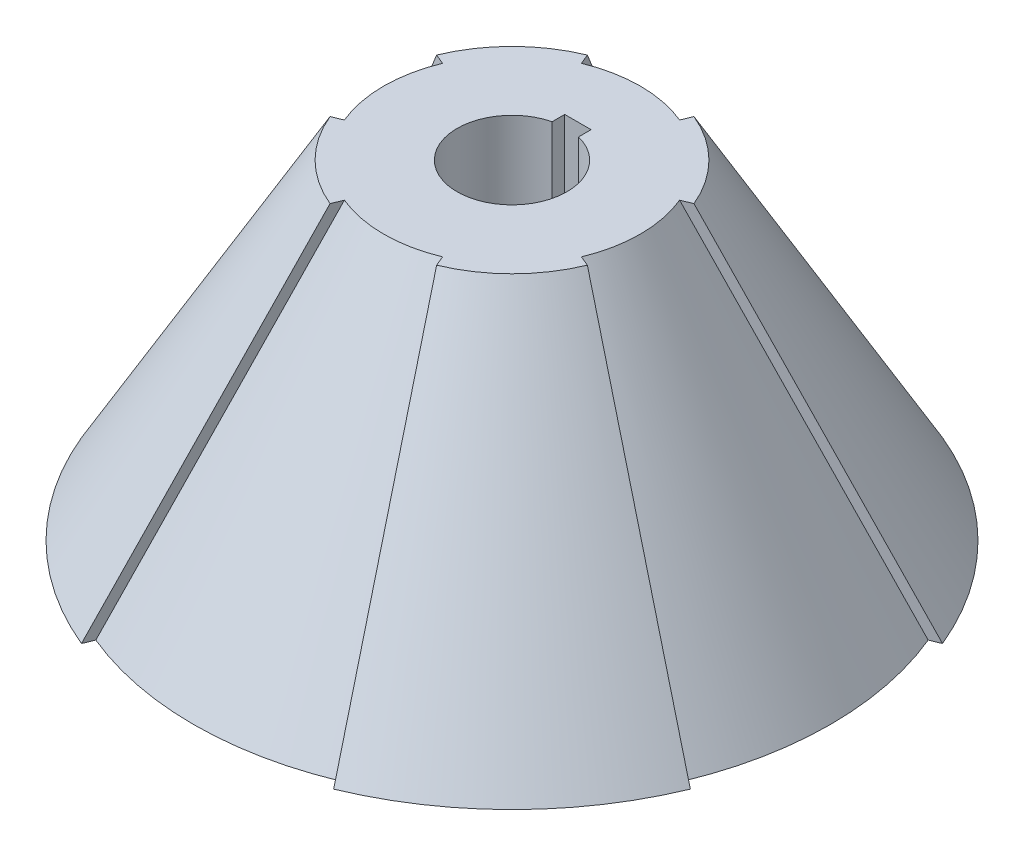
ISO-10303-21;
HEADER;
FILE_DESCRIPTION(('STEP AP214'),'2;1');
FILE_NAME('part.step','',(''),(''),'','','');
FILE_SCHEMA(('AUTOMOTIVE_DESIGN { 1 0 10303 214 1 1 1 1 }'));
ENDSEC;
DATA;
#1=APPLICATION_CONTEXT('core data for automotive mechanical design processes');
#2=APPLICATION_PROTOCOL_DEFINITION('international standard','automotive_design',2000,#1);
#3=PRODUCT_CONTEXT('',#1,'mechanical');
#4=PRODUCT('Part','Part','',(#3));
#5=PRODUCT_RELATED_PRODUCT_CATEGORY('part','',(#4));
#6=PRODUCT_DEFINITION_FORMATION('','',#4);
#7=PRODUCT_DEFINITION_CONTEXT('part definition',#1,'design');
#8=PRODUCT_DEFINITION('design','',#6,#7);
#9=PRODUCT_DEFINITION_SHAPE('','',#8);
#10=(LENGTH_UNIT() NAMED_UNIT(*) SI_UNIT(.MILLI.,.METRE.));
#11=(NAMED_UNIT(*) PLANE_ANGLE_UNIT() SI_UNIT($,.RADIAN.));
#12=(NAMED_UNIT(*) SI_UNIT($,.STERADIAN.) SOLID_ANGLE_UNIT());
#13=UNCERTAINTY_MEASURE_WITH_UNIT(LENGTH_MEASURE(1.E-05),#10,'distance_accuracy_value','');
#14=(GEOMETRIC_REPRESENTATION_CONTEXT(3) GLOBAL_UNCERTAINTY_ASSIGNED_CONTEXT((#13)) GLOBAL_UNIT_ASSIGNED_CONTEXT((#10,
#11,#12)) REPRESENTATION_CONTEXT('',''));
#15=CARTESIAN_POINT('',(0.,0.,0.));
#16=DIRECTION('',(0.,0.,1.));
#17=DIRECTION('',(1.,0.,0.));
#18=AXIS2_PLACEMENT_3D('',#15,#16,#17);
#19=CARTESIAN_POINT('',(38.1,0.,0.));
#20=DIRECTION('',(0.,-1.,0.));
#21=DIRECTION('',(0.,0.,-1.));
#22=AXIS2_PLACEMENT_3D('',#19,#20,#21);
#23=PLANE('',#22);
#24=CARTESIAN_POINT('',(0.,0.,0.));
#25=DIRECTION('',(0.,-1.,0.));
#26=DIRECTION('',(0.,0.,-1.));
#27=AXIS2_PLACEMENT_3D('',#24,#25,#26);
#28=CIRCLE('',#27,6.35);
#29=CARTESIAN_POINT('',(1.524,0.,-6.16440783855189));
#30=VERTEX_POINT('',#29);
#31=CARTESIAN_POINT('',(-1.524,0.,-6.16440783855189));
#32=VERTEX_POINT('',#31);
#33=EDGE_CURVE('E326',#30,#32,#28,.T.);
#34=ORIENTED_EDGE('',*,*,#33,.F.);
#35=DIRECTION('',(0.,0.,-1.));
#36=VECTOR('',#35,1.);
#37=CARTESIAN_POINT('',(1.524,0.,0.));
#38=LINE('',#37,#36);
#39=CARTESIAN_POINT('',(1.524,0.,-7.62));
#40=VERTEX_POINT('',#39);
#41=EDGE_CURVE('E311',#30,#40,#38,.T.);
#42=ORIENTED_EDGE('',*,*,#41,.T.);
#43=DIRECTION('',(-1.,0.,0.));
#44=VECTOR('',#43,1.);
#45=CARTESIAN_POINT('',(38.1,0.,-7.62));
#46=LINE('',#45,#44);
#47=CARTESIAN_POINT('',(-1.524,0.,-7.62));
#48=VERTEX_POINT('',#47);
#49=EDGE_CURVE('E308',#40,#48,#46,.T.);
#50=ORIENTED_EDGE('',*,*,#49,.T.);
#51=DIRECTION('',(0.,0.,1.));
#52=VECTOR('',#51,1.);
#53=CARTESIAN_POINT('',(-1.524,0.,0.));
#54=LINE('',#53,#52);
#55=EDGE_CURVE('E303',#48,#32,#54,.T.);
#56=ORIENTED_EDGE('',*,*,#55,.T.);
#57=EDGE_LOOP('',(#34,#42,#50,#56));
#58=FACE_BOUND('',#57,.T.);
#59=CARTESIAN_POINT('',(0.,0.,0.));
#60=DIRECTION('',(0.,-1.,0.));
#61=DIRECTION('',(0.,0.,-1.));
#62=AXIS2_PLACEMENT_3D('',#59,#60,#61);
#63=CIRCLE('',#62,38.1);
#64=CARTESIAN_POINT('',(-14.58023877311,0.,35.19981018868));
#65=VERTEX_POINT('',#64);
#66=CARTESIAN_POINT('',(-35.1998101886802,0.,14.5802387731096));
#67=VERTEX_POINT('',#66);
#68=EDGE_CURVE('E413',#65,#67,#63,.T.);
#69=ORIENTED_EDGE('',*,*,#68,.T.);
#70=DIRECTION('',(-0.923879532511291,0.,0.382683432365081));
#71=VECTOR('',#70,1.);
#72=CARTESIAN_POINT('',(-34.0264831823908,0.,14.0942308140059));
#73=LINE('',#72,#71);
#74=CARTESIAN_POINT('',(-34.0264831823908,0.,14.0942308140059));
#75=VERTEX_POINT('',#74);
#76=EDGE_CURVE('E218',#75,#67,#73,.T.);
#77=ORIENTED_EDGE('',*,*,#76,.F.);
#78=CARTESIAN_POINT('',(0.,0.,0.));
#79=DIRECTION('',(0.,-1.,0.));
#80=DIRECTION('',(-1.,0.,0.));
#81=AXIS2_PLACEMENT_3D('',#78,#79,#80);
#82=CIRCLE('',#81,36.83);
#83=CARTESIAN_POINT('',(-34.0264831823906,0.,-14.0942308140067));
#84=VERTEX_POINT('',#83);
#85=EDGE_CURVE('E197',#75,#84,#82,.T.);
#86=ORIENTED_EDGE('',*,*,#85,.T.);
#87=DIRECTION('',(-0.923879532511283,0.,-0.3826834323651));
#88=VECTOR('',#87,1.);
#89=CARTESIAN_POINT('',(-34.0264831823906,0.,-14.0942308140067));
#90=LINE('',#89,#88);
#91=CARTESIAN_POINT('',(-35.1998101886799,0.,-14.5802387731103));
#92=VERTEX_POINT('',#91);
#93=EDGE_CURVE('E201',#84,#92,#90,.T.);
#94=ORIENTED_EDGE('',*,*,#93,.T.);
#95=CARTESIAN_POINT('',(-14.58023877311,0.,-35.19981018868));
#96=VERTEX_POINT('',#95);
#97=EDGE_CURVE('E314',#92,#96,#63,.T.);
#98=ORIENTED_EDGE('',*,*,#97,.T.);
#99=DIRECTION('',(-0.382683432365091,0.,-0.923879532511287));
#100=VECTOR('',#99,1.);
#101=CARTESIAN_POINT('',(-14.0942308140063,0.,-34.0264831823907));
#102=LINE('',#101,#100);
#103=CARTESIAN_POINT('',(-14.0942308140063,0.,-34.0264831823907));
#104=VERTEX_POINT('',#103);
#105=EDGE_CURVE('E286',#104,#96,#102,.T.);
#106=ORIENTED_EDGE('',*,*,#105,.F.);
#107=CARTESIAN_POINT('',(0.,0.,0.));
#108=DIRECTION('',(0.,-1.,0.));
#109=DIRECTION('',(0.,0.,-1.));
#110=AXIS2_PLACEMENT_3D('',#107,#108,#109);
#111=CIRCLE('',#110,36.83);
#112=CARTESIAN_POINT('',(14.0942308140063,0.,-34.0264831823907));
#113=VERTEX_POINT('',#112);
#114=EDGE_CURVE('E289',#104,#113,#111,.T.);
#115=ORIENTED_EDGE('',*,*,#114,.T.);
#116=DIRECTION('',(0.382683432365091,0.,-0.923879532511287));
#117=VECTOR('',#116,1.);
#118=CARTESIAN_POINT('',(14.0942308140063,0.,-34.0264831823907));
#119=LINE('',#118,#117);
#120=CARTESIAN_POINT('',(14.58023877311,0.,-35.19981018868));
#121=VERTEX_POINT('',#120);
#122=EDGE_CURVE('E275',#113,#121,#119,.T.);
#123=ORIENTED_EDGE('',*,*,#122,.T.);
#124=CARTESIAN_POINT('',(35.1998101886801,0.,-14.5802387731098));
#125=VERTEX_POINT('',#124);
#126=EDGE_CURVE('E315',#121,#125,#63,.T.);
#127=ORIENTED_EDGE('',*,*,#126,.T.);
#128=DIRECTION('',(0.923879532511288,0.,-0.382683432365088));
#129=VECTOR('',#128,1.);
#130=CARTESIAN_POINT('',(34.0264831823907,0.,-14.0942308140062));
#131=LINE('',#130,#129);
#132=CARTESIAN_POINT('',(34.0264831823907,0.,-14.0942308140062));
#133=VERTEX_POINT('',#132);
#134=EDGE_CURVE('E260',#133,#125,#131,.T.);
#135=ORIENTED_EDGE('',*,*,#134,.F.);
#136=CARTESIAN_POINT('',(0.,0.,0.));
#137=DIRECTION('',(0.,-1.,0.));
#138=DIRECTION('',(1.,0.,0.));
#139=AXIS2_PLACEMENT_3D('',#136,#137,#138);
#140=CIRCLE('',#139,36.83);
#141=CARTESIAN_POINT('',(34.0264831823906,0.,14.0942308140064));
#142=VERTEX_POINT('',#141);
#143=EDGE_CURVE('E262',#133,#142,#140,.T.);
#144=ORIENTED_EDGE('',*,*,#143,.T.);
#145=DIRECTION('',(0.923879532511286,0.,0.382683432365094));
#146=VECTOR('',#145,1.);
#147=CARTESIAN_POINT('',(34.0264831823906,0.,14.0942308140064));
#148=LINE('',#147,#146);
#149=CARTESIAN_POINT('',(35.19981018868,0.,14.5802387731101));
#150=VERTEX_POINT('',#149);
#151=EDGE_CURVE('E250',#142,#150,#148,.T.);
#152=ORIENTED_EDGE('',*,*,#151,.T.);
#153=CARTESIAN_POINT('',(14.58023877311,0.,35.19981018868));
#154=VERTEX_POINT('',#153);
#155=EDGE_CURVE('E318',#150,#154,#63,.T.);
#156=ORIENTED_EDGE('',*,*,#155,.T.);
#157=DIRECTION('',(0.382683432365091,0.,0.923879532511287));
#158=VECTOR('',#157,1.);
#159=CARTESIAN_POINT('',(14.0942308140063,0.,34.0264831823907));
#160=LINE('',#159,#158);
#161=CARTESIAN_POINT('',(14.0942308140063,0.,34.0264831823907));
#162=VERTEX_POINT('',#161);
#163=EDGE_CURVE('E235',#162,#154,#160,.T.);
#164=ORIENTED_EDGE('',*,*,#163,.F.);
#165=CARTESIAN_POINT('',(0.,0.,0.));
#166=DIRECTION('',(0.,-1.,0.));
#167=DIRECTION('',(0.,0.,1.));
#168=AXIS2_PLACEMENT_3D('',#165,#166,#167);
#169=CIRCLE('',#168,36.83);
#170=CARTESIAN_POINT('',(-14.0942308140063,0.,34.0264831823907));
#171=VERTEX_POINT('',#170);
#172=EDGE_CURVE('E237',#162,#171,#169,.T.);
#173=ORIENTED_EDGE('',*,*,#172,.T.);
#174=DIRECTION('',(-0.382683432365091,0.,0.923879532511287));
#175=VECTOR('',#174,1.);
#176=CARTESIAN_POINT('',(-14.0942308140063,0.,34.0264831823907));
#177=LINE('',#176,#175);
#178=EDGE_CURVE('E225',#171,#65,#177,.T.);
#179=ORIENTED_EDGE('',*,*,#178,.T.);
#180=EDGE_LOOP('',(#69,#77,#86,#94,#98,#106,#115,#123,#127,#135,#144,#152,#156,#164,#173,#179));
#181=FACE_BOUND('',#180,.T.);
#182=ADVANCED_FACE('F50',(#58,#181),#23,.T.);
#183=CARTESIAN_POINT('',(6.35,38.1,0.));
#184=DIRECTION('',(0.,1.,0.));
#185=DIRECTION('',(0.,0.,1.));
#186=AXIS2_PLACEMENT_3D('',#183,#184,#185);
#187=PLANE('',#186);
#188=DIRECTION('',(1.,0.,0.));
#189=VECTOR('',#188,1.);
#190=CARTESIAN_POINT('',(6.35,38.1,-7.62));
#191=LINE('',#190,#189);
#192=CARTESIAN_POINT('',(-1.524,38.1,-7.62));
#193=VERTEX_POINT('',#192);
#194=CARTESIAN_POINT('',(1.524,38.1,-7.62));
#195=VERTEX_POINT('',#194);
#196=EDGE_CURVE('E57',#193,#195,#191,.T.);
#197=ORIENTED_EDGE('',*,*,#196,.T.);
#198=DIRECTION('',(0.,0.,1.));
#199=VECTOR('',#198,1.);
#200=CARTESIAN_POINT('',(1.524,38.1,0.));
#201=LINE('',#200,#199);
#202=CARTESIAN_POINT('',(1.524,38.1,-6.16440783855189));
#203=VERTEX_POINT('',#202);
#204=EDGE_CURVE('E13',#195,#203,#201,.T.);
#205=ORIENTED_EDGE('',*,*,#204,.T.);
#206=CARTESIAN_POINT('',(0.,38.1,0.));
#207=DIRECTION('',(0.,-1.,0.));
#208=DIRECTION('',(0.,0.,-1.));
#209=AXIS2_PLACEMENT_3D('',#206,#207,#208);
#210=CIRCLE('',#209,6.35);
#211=CARTESIAN_POINT('',(-1.524,38.1,-6.16440783855189));
#212=VERTEX_POINT('',#211);
#213=EDGE_CURVE('E322',#203,#212,#210,.T.);
#214=ORIENTED_EDGE('',*,*,#213,.T.);
#215=DIRECTION('',(0.,0.,-1.));
#216=VECTOR('',#215,1.);
#217=CARTESIAN_POINT('',(-1.524,38.1,0.));
#218=LINE('',#217,#216);
#219=EDGE_CURVE('E329',#212,#193,#218,.T.);
#220=ORIENTED_EDGE('',*,*,#219,.T.);
#221=EDGE_LOOP('',(#197,#205,#214,#220));
#222=FACE_BOUND('',#221,.T.);
#223=CARTESIAN_POINT('',(0.,38.1,0.));
#224=DIRECTION('',(0.,-1.,0.));
#225=DIRECTION('',(-1.,0.,0.));
#226=AXIS2_PLACEMENT_3D('',#223,#224,#225);
#227=CIRCLE('',#226,14.832954743875);
#228=CARTESIAN_POINT('',(-13.7038632945324,38.1,5.676326033502));
#229=VERTEX_POINT('',#228);
#230=CARTESIAN_POINT('',(-13.7038632945322,38.1,-5.67632603350228));
#231=VERTEX_POINT('',#230);
#232=EDGE_CURVE('E188',#229,#231,#227,.T.);
#233=ORIENTED_EDGE('',*,*,#232,.F.);
#234=DIRECTION('',(0.923879532511291,0.,-0.382683432365081));
#235=VECTOR('',#234,1.);
#236=CARTESIAN_POINT('',(-14.8771903008217,38.1,6.16233399260565));
#237=LINE('',#236,#235);
#238=CARTESIAN_POINT('',(-14.8771903008217,38.1,6.16233399260565));
#239=VERTEX_POINT('',#238);
#240=EDGE_CURVE('E215',#239,#229,#237,.T.);
#241=ORIENTED_EDGE('',*,*,#240,.F.);
#242=CARTESIAN_POINT('',(0.,38.1,0.));
#243=DIRECTION('',(0.,-1.,0.));
#244=DIRECTION('',(0.,0.,-1.));
#245=AXIS2_PLACEMENT_3D('',#242,#243,#244);
#246=CIRCLE('',#245,16.102954743875);
#247=CARTESIAN_POINT('',(-6.16233399260581,38.1,14.8771903008216));
#248=VERTEX_POINT('',#247);
#249=EDGE_CURVE('E394',#248,#239,#246,.T.);
#250=ORIENTED_EDGE('',*,*,#249,.F.);
#251=DIRECTION('',(0.382683432365091,0.,-0.923879532511287));
#252=VECTOR('',#251,1.);
#253=CARTESIAN_POINT('',(-6.16233399260581,38.1,14.8771903008217));
#254=LINE('',#253,#252);
#255=CARTESIAN_POINT('',(-5.67632603350214,38.1,13.7038632945323));
#256=VERTEX_POINT('',#255);
#257=EDGE_CURVE('E72',#248,#256,#254,.T.);
#258=ORIENTED_EDGE('',*,*,#257,.T.);
#259=CARTESIAN_POINT('',(0.,38.1,0.));
#260=DIRECTION('',(0.,-1.,0.));
#261=DIRECTION('',(0.,0.,1.));
#262=AXIS2_PLACEMENT_3D('',#259,#260,#261);
#263=CIRCLE('',#262,14.832954743875);
#264=CARTESIAN_POINT('',(5.67632603350214,38.1,13.7038632945323));
#265=VERTEX_POINT('',#264);
#266=EDGE_CURVE('E240',#265,#256,#263,.T.);
#267=ORIENTED_EDGE('',*,*,#266,.F.);
#268=DIRECTION('',(-0.382683432365091,0.,-0.923879532511287));
#269=VECTOR('',#268,1.);
#270=CARTESIAN_POINT('',(6.16233399260581,38.1,14.8771903008217));
#271=LINE('',#270,#269);
#272=CARTESIAN_POINT('',(6.16233399260581,38.1,14.8771903008217));
#273=VERTEX_POINT('',#272);
#274=EDGE_CURVE('E230',#273,#265,#271,.T.);
#275=ORIENTED_EDGE('',*,*,#274,.F.);
#276=CARTESIAN_POINT('',(14.8771903008216,38.1,6.16233399260586));
#277=VERTEX_POINT('',#276);
#278=EDGE_CURVE('E323',#277,#273,#246,.T.);
#279=ORIENTED_EDGE('',*,*,#278,.F.);
#280=DIRECTION('',(-0.923879532511286,0.,-0.382683432365094));
#281=VECTOR('',#280,1.);
#282=CARTESIAN_POINT('',(14.8771903008216,38.1,6.16233399260586));
#283=LINE('',#282,#281);
#284=CARTESIAN_POINT('',(13.7038632945323,38.1,5.67632603350219));
#285=VERTEX_POINT('',#284);
#286=EDGE_CURVE('E245',#277,#285,#283,.T.);
#287=ORIENTED_EDGE('',*,*,#286,.T.);
#288=CARTESIAN_POINT('',(0.,38.1,0.));
#289=DIRECTION('',(0.,-1.,0.));
#290=DIRECTION('',(1.,0.,0.));
#291=AXIS2_PLACEMENT_3D('',#288,#289,#290);
#292=CIRCLE('',#291,14.832954743875);
#293=CARTESIAN_POINT('',(13.7038632945323,38.1,-5.67632603350209));
#294=VERTEX_POINT('',#293);
#295=EDGE_CURVE('E265',#294,#285,#292,.T.);
#296=ORIENTED_EDGE('',*,*,#295,.F.);
#297=DIRECTION('',(-0.923879532511288,0.,0.382683432365088));
#298=VECTOR('',#297,1.);
#299=CARTESIAN_POINT('',(14.8771903008217,38.1,-6.16233399260576));
#300=LINE('',#299,#298);
#301=CARTESIAN_POINT('',(14.8771903008217,38.1,-6.16233399260576));
#302=VERTEX_POINT('',#301);
#303=EDGE_CURVE('E255',#302,#294,#300,.T.);
#304=ORIENTED_EDGE('',*,*,#303,.F.);
#305=CARTESIAN_POINT('',(6.16233399260581,38.1,-14.8771903008216));
#306=VERTEX_POINT('',#305);
#307=EDGE_CURVE('E319',#306,#302,#246,.T.);
#308=ORIENTED_EDGE('',*,*,#307,.F.);
#309=DIRECTION('',(-0.382683432365091,0.,0.923879532511287));
#310=VECTOR('',#309,1.);
#311=CARTESIAN_POINT('',(6.16233399260581,38.1,-14.8771903008217));
#312=LINE('',#311,#310);
#313=CARTESIAN_POINT('',(5.67632603350214,38.1,-13.7038632945323));
#314=VERTEX_POINT('',#313);
#315=EDGE_CURVE('E270',#306,#314,#312,.T.);
#316=ORIENTED_EDGE('',*,*,#315,.T.);
#317=CARTESIAN_POINT('',(0.,38.1,0.));
#318=DIRECTION('',(0.,-1.,0.));
#319=DIRECTION('',(0.,0.,-1.));
#320=AXIS2_PLACEMENT_3D('',#317,#318,#319);
#321=CIRCLE('',#320,14.832954743875);
#322=CARTESIAN_POINT('',(-5.67632603350214,38.1,-13.7038632945323));
#323=VERTEX_POINT('',#322);
#324=EDGE_CURVE('E292',#323,#314,#321,.T.);
#325=ORIENTED_EDGE('',*,*,#324,.F.);
#326=DIRECTION('',(0.382683432365091,0.,0.923879532511287));
#327=VECTOR('',#326,1.);
#328=CARTESIAN_POINT('',(-6.16233399260581,38.1,-14.8771903008217));
#329=LINE('',#328,#327);
#330=CARTESIAN_POINT('',(-6.16233399260581,38.1,-14.8771903008217));
#331=VERTEX_POINT('',#330);
#332=EDGE_CURVE('E281',#331,#323,#329,.T.);
#333=ORIENTED_EDGE('',*,*,#332,.F.);
#334=CARTESIAN_POINT('',(-14.8771903008216,38.1,-6.16233399260596));
#335=VERTEX_POINT('',#334);
#336=EDGE_CURVE('E207',#335,#331,#246,.T.);
#337=ORIENTED_EDGE('',*,*,#336,.F.);
#338=DIRECTION('',(0.923879532511283,0.,0.3826834323651));
#339=VECTOR('',#338,1.);
#340=CARTESIAN_POINT('',(-14.8771903008216,38.1,-6.16233399260597));
#341=LINE('',#340,#339);
#342=EDGE_CURVE('E64',#335,#231,#341,.T.);
#343=ORIENTED_EDGE('',*,*,#342,.T.);
#344=EDGE_LOOP('',(#233,#241,#250,#258,#267,#275,#279,#287,#296,#304,#308,#316,#325,#333,#337,#343));
#345=FACE_BOUND('',#344,.T.);
#346=ADVANCED_FACE('F205',(#222,#345),#187,.T.);
#347=CARTESIAN_POINT('',(0.,0.,0.));
#348=DIRECTION('',(0.,-1.,0.));
#349=DIRECTION('',(0.,0.,-1.));
#350=AXIS2_PLACEMENT_3D('',#347,#348,#349);
#351=CONICAL_SURFACE('',#350,38.1,0.523598775598304);
#352=ORIENTED_EDGE('',*,*,#249,.T.);
#353=DIRECTION('',(0.461939766255649,0.866025403784436,-0.191341716182542));
#354=VECTOR('',#353,1.);
#355=CARTESIAN_POINT('',(-35.1998101886802,0.,14.5802387731096));
#356=LINE('',#355,#354);
#357=EDGE_CURVE('E213',#67,#239,#356,.T.);
#358=ORIENTED_EDGE('',*,*,#357,.F.);
#359=ORIENTED_EDGE('',*,*,#68,.F.);
#360=DIRECTION('',(0.191341716182547,0.866025403784436,-0.461939766255647));
#361=VECTOR('',#360,1.);
#362=CARTESIAN_POINT('',(-14.58023877311,0.,35.19981018868));
#363=LINE('',#362,#361);
#364=EDGE_CURVE('E196',#65,#248,#363,.T.);
#365=ORIENTED_EDGE('',*,*,#364,.T.);
#366=EDGE_LOOP('',(#352,#358,#359,#365));
#367=FACE_BOUND('',#366,.T.);
#368=ADVANCED_FACE('F363',(#367),#351,.T.);
#369=ORIENTED_EDGE('',*,*,#278,.T.);
#370=DIRECTION('',(-0.191341716182547,0.866025403784436,-0.461939766255648));
#371=VECTOR('',#370,1.);
#372=CARTESIAN_POINT('',(14.58023877311,0.,35.19981018868));
#373=LINE('',#372,#371);
#374=EDGE_CURVE('E228',#154,#273,#373,.T.);
#375=ORIENTED_EDGE('',*,*,#374,.F.);
#376=ORIENTED_EDGE('',*,*,#155,.F.);
#377=DIRECTION('',(-0.461939766255647,0.866025403784436,-0.191341716182549));
#378=VECTOR('',#377,1.);
#379=CARTESIAN_POINT('',(35.19981018868,0.,14.5802387731101));
#380=LINE('',#379,#378);
#381=EDGE_CURVE('E242',#150,#277,#380,.T.);
#382=ORIENTED_EDGE('',*,*,#381,.T.);
#383=EDGE_LOOP('',(#369,#375,#376,#382));
#384=FACE_BOUND('',#383,.T.);
#385=ADVANCED_FACE('F368',(#384),#351,.T.);
#386=ORIENTED_EDGE('',*,*,#307,.T.);
#387=DIRECTION('',(-0.461939766255648,0.866025403784436,0.191341716182545));
#388=VECTOR('',#387,1.);
#389=CARTESIAN_POINT('',(35.1998101886801,0.,-14.5802387731098));
#390=LINE('',#389,#388);
#391=EDGE_CURVE('E253',#125,#302,#390,.T.);
#392=ORIENTED_EDGE('',*,*,#391,.F.);
#393=ORIENTED_EDGE('',*,*,#126,.F.);
#394=DIRECTION('',(-0.191341716182547,0.866025403784436,0.461939766255647));
#395=VECTOR('',#394,1.);
#396=CARTESIAN_POINT('',(14.58023877311,0.,-35.19981018868));
#397=LINE('',#396,#395);
#398=EDGE_CURVE('E267',#121,#306,#397,.T.);
#399=ORIENTED_EDGE('',*,*,#398,.T.);
#400=EDGE_LOOP('',(#386,#392,#393,#399));
#401=FACE_BOUND('',#400,.T.);
#402=ADVANCED_FACE('F378',(#401),#351,.T.);
#403=DIRECTION('',(0.461939766255645,0.866025403784436,0.191341716182552));
#404=VECTOR('',#403,1.);
#405=CARTESIAN_POINT('',(-35.1998101886799,0.,-14.5802387731103));
#406=LINE('',#405,#404);
#407=EDGE_CURVE('E208',#92,#335,#406,.T.);
#408=ORIENTED_EDGE('',*,*,#407,.T.);
#409=ORIENTED_EDGE('',*,*,#336,.T.);
#410=DIRECTION('',(0.191341716182547,0.866025403784436,0.461939766255647));
#411=VECTOR('',#410,1.);
#412=CARTESIAN_POINT('',(-14.58023877311,0.,-35.19981018868));
#413=LINE('',#412,#411);
#414=EDGE_CURVE('E278',#96,#331,#413,.T.);
#415=ORIENTED_EDGE('',*,*,#414,.F.);
#416=ORIENTED_EDGE('',*,*,#97,.F.);
#417=EDGE_LOOP('',(#408,#409,#415,#416));
#418=FACE_BOUND('',#417,.T.);
#419=ADVANCED_FACE('F371',(#418),#351,.T.);
#420=CARTESIAN_POINT('',(0.,0.,0.));
#421=DIRECTION('',(0.,-1.,0.));
#422=DIRECTION('',(0.,0.,-1.));
#423=AXIS2_PLACEMENT_3D('',#420,#421,#422);
#424=CYLINDRICAL_SURFACE('',#423,6.35);
#425=ORIENTED_EDGE('',*,*,#213,.F.);
#426=DIRECTION('',(0.,-1.,0.));
#427=VECTOR('',#426,1.);
#428=CARTESIAN_POINT('',(1.524,228.6,-6.16440783855189));
#429=LINE('',#428,#427);
#430=EDGE_CURVE('E300',#203,#30,#429,.T.);
#431=ORIENTED_EDGE('',*,*,#430,.T.);
#432=ORIENTED_EDGE('',*,*,#33,.T.);
#433=DIRECTION('',(0.,-1.,0.));
#434=VECTOR('',#433,1.);
#435=CARTESIAN_POINT('',(-1.524,228.6,-6.16440783855189));
#436=LINE('',#435,#434);
#437=EDGE_CURVE('E295',#212,#32,#436,.T.);
#438=ORIENTED_EDGE('',*,*,#437,.F.);
#439=EDGE_LOOP('',(#425,#431,#432,#438));
#440=FACE_BOUND('',#439,.T.);
#441=ADVANCED_FACE('F345',(#440),#424,.F.);
#442=CARTESIAN_POINT('',(1.524,228.6,-7.62));
#443=DIRECTION('',(-1.,0.,0.));
#444=DIRECTION('',(0.,0.,1.));
#445=AXIS2_PLACEMENT_3D('',#442,#443,#444);
#446=PLANE('',#445);
#447=ORIENTED_EDGE('',*,*,#41,.F.);
#448=ORIENTED_EDGE('',*,*,#430,.F.);
#449=ORIENTED_EDGE('',*,*,#204,.F.);
#450=DIRECTION('',(0.,-1.,0.));
#451=VECTOR('',#450,1.);
#452=CARTESIAN_POINT('',(1.524,228.6,-7.62));
#453=LINE('',#452,#451);
#454=EDGE_CURVE('E297',#195,#40,#453,.T.);
#455=ORIENTED_EDGE('',*,*,#454,.T.);
#456=EDGE_LOOP('',(#447,#448,#449,#455));
#457=FACE_BOUND('',#456,.T.);
#458=ADVANCED_FACE('F339',(#457),#446,.T.);
#459=CARTESIAN_POINT('',(-1.524,228.6,-7.62));
#460=DIRECTION('',(0.,0.,1.));
#461=DIRECTION('',(1.,0.,0.));
#462=AXIS2_PLACEMENT_3D('',#459,#460,#461);
#463=PLANE('',#462);
#464=ORIENTED_EDGE('',*,*,#49,.F.);
#465=ORIENTED_EDGE('',*,*,#454,.F.);
#466=ORIENTED_EDGE('',*,*,#196,.F.);
#467=DIRECTION('',(0.,-1.,0.));
#468=VECTOR('',#467,1.);
#469=CARTESIAN_POINT('',(-1.524,228.6,-7.62));
#470=LINE('',#469,#468);
#471=EDGE_CURVE('E294',#193,#48,#470,.T.);
#472=ORIENTED_EDGE('',*,*,#471,.T.);
#473=EDGE_LOOP('',(#464,#465,#466,#472));
#474=FACE_BOUND('',#473,.T.);
#475=ADVANCED_FACE('F337',(#474),#463,.T.);
#476=CARTESIAN_POINT('',(-1.524,228.6,-7.62));
#477=DIRECTION('',(1.,0.,0.));
#478=DIRECTION('',(0.,0.,-1.));
#479=AXIS2_PLACEMENT_3D('',#476,#477,#478);
#480=PLANE('',#479);
#481=ORIENTED_EDGE('',*,*,#55,.F.);
#482=ORIENTED_EDGE('',*,*,#471,.F.);
#483=ORIENTED_EDGE('',*,*,#219,.F.);
#484=ORIENTED_EDGE('',*,*,#437,.T.);
#485=EDGE_LOOP('',(#481,#482,#483,#484));
#486=FACE_BOUND('',#485,.T.);
#487=ADVANCED_FACE('F347',(#486),#480,.T.);
#488=CARTESIAN_POINT('',(0.,38.1,0.));
#489=DIRECTION('',(0.,-1.,0.));
#490=DIRECTION('',(0.,0.,-1.));
#491=AXIS2_PLACEMENT_3D('',#488,#489,#490);
#492=CONICAL_SURFACE('',#491,14.832954743875,0.523598775598304);
#493=ORIENTED_EDGE('',*,*,#114,.F.);
#494=DIRECTION('',(-0.191341716182547,-0.866025403784436,-0.461939766255648));
#495=VECTOR('',#494,1.);
#496=CARTESIAN_POINT('',(-5.67632603350214,38.1,-13.7038632945323));
#497=LINE('',#496,#495);
#498=EDGE_CURVE('E283',#323,#104,#497,.T.);
#499=ORIENTED_EDGE('',*,*,#498,.F.);
#500=ORIENTED_EDGE('',*,*,#324,.T.);
#501=DIRECTION('',(0.191341716182547,-0.866025403784436,-0.461939766255648));
#502=VECTOR('',#501,1.);
#503=CARTESIAN_POINT('',(5.67632603350214,38.1,-13.7038632945323));
#504=LINE('',#503,#502);
#505=EDGE_CURVE('E273',#314,#113,#504,.T.);
#506=ORIENTED_EDGE('',*,*,#505,.T.);
#507=EDGE_LOOP('',(#493,#499,#500,#506));
#508=FACE_BOUND('',#507,.T.);
#509=ADVANCED_FACE('F349',(#508),#492,.T.);
#510=CARTESIAN_POINT('',(0.,0.,0.));
#511=DIRECTION('',(0.923879532511287,0.,-0.382683432365091));
#512=DIRECTION('',(-0.382683432365091,0.,-0.923879532511287));
#513=AXIS2_PLACEMENT_3D('',#510,#511,#512);
#514=PLANE('',#513);
#515=ORIENTED_EDGE('',*,*,#414,.T.);
#516=ORIENTED_EDGE('',*,*,#332,.T.);
#517=ORIENTED_EDGE('',*,*,#498,.T.);
#518=ORIENTED_EDGE('',*,*,#105,.T.);
#519=EDGE_LOOP('',(#515,#516,#517,#518));
#520=FACE_BOUND('',#519,.T.);
#521=ADVANCED_FACE('F355',(#520),#514,.T.);
#522=CARTESIAN_POINT('',(0.,0.,0.));
#523=DIRECTION('',(0.923879532511287,0.,0.382683432365091));
#524=DIRECTION('',(0.382683432365091,0.,-0.923879532511287));
#525=AXIS2_PLACEMENT_3D('',#522,#523,#524);
#526=PLANE('',#525);
#527=ORIENTED_EDGE('',*,*,#398,.F.);
#528=ORIENTED_EDGE('',*,*,#122,.F.);
#529=ORIENTED_EDGE('',*,*,#505,.F.);
#530=ORIENTED_EDGE('',*,*,#315,.F.);
#531=EDGE_LOOP('',(#527,#528,#529,#530));
#532=FACE_BOUND('',#531,.T.);
#533=ADVANCED_FACE('F428',(#532),#526,.F.);
#534=CARTESIAN_POINT('',(0.,38.1,0.));
#535=DIRECTION('',(0.,-1.,0.));
#536=DIRECTION('',(1.,0.,0.));
#537=AXIS2_PLACEMENT_3D('',#534,#535,#536);
#538=CONICAL_SURFACE('',#537,14.832954743875,0.523598775598304);
#539=ORIENTED_EDGE('',*,*,#143,.F.);
#540=DIRECTION('',(0.461939766255648,-0.866025403784436,-0.191341716182546));
#541=VECTOR('',#540,1.);
#542=CARTESIAN_POINT('',(13.7038632945323,38.1,-5.67632603350209));
#543=LINE('',#542,#541);
#544=EDGE_CURVE('E257',#294,#133,#543,.T.);
#545=ORIENTED_EDGE('',*,*,#544,.F.);
#546=ORIENTED_EDGE('',*,*,#295,.T.);
#547=DIRECTION('',(0.461939766255647,-0.866025403784436,0.191341716182549));
#548=VECTOR('',#547,1.);
#549=CARTESIAN_POINT('',(13.7038632945323,38.1,5.67632603350219));
#550=LINE('',#549,#548);
#551=EDGE_CURVE('E248',#285,#142,#550,.T.);
#552=ORIENTED_EDGE('',*,*,#551,.T.);
#553=EDGE_LOOP('',(#539,#545,#546,#552));
#554=FACE_BOUND('',#553,.T.);
#555=ADVANCED_FACE('F419',(#554),#538,.T.);
#556=CARTESIAN_POINT('',(0.,0.,0.));
#557=DIRECTION('',(0.382683432365088,0.,0.923879532511288));
#558=DIRECTION('',(0.923879532511288,0.,-0.382683432365088));
#559=AXIS2_PLACEMENT_3D('',#556,#557,#558);
#560=PLANE('',#559);
#561=ORIENTED_EDGE('',*,*,#391,.T.);
#562=ORIENTED_EDGE('',*,*,#303,.T.);
#563=ORIENTED_EDGE('',*,*,#544,.T.);
#564=ORIENTED_EDGE('',*,*,#134,.T.);
#565=EDGE_LOOP('',(#561,#562,#563,#564));
#566=FACE_BOUND('',#565,.T.);
#567=ADVANCED_FACE('F442',(#566),#560,.T.);
#568=CARTESIAN_POINT('',(0.,0.,0.));
#569=DIRECTION('',(-0.382683432365094,0.,0.923879532511286));
#570=DIRECTION('',(0.923879532511286,0.,0.382683432365094));
#571=AXIS2_PLACEMENT_3D('',#568,#569,#570);
#572=PLANE('',#571);
#573=ORIENTED_EDGE('',*,*,#381,.F.);
#574=ORIENTED_EDGE('',*,*,#151,.F.);
#575=ORIENTED_EDGE('',*,*,#551,.F.);
#576=ORIENTED_EDGE('',*,*,#286,.F.);
#577=EDGE_LOOP('',(#573,#574,#575,#576));
#578=FACE_BOUND('',#577,.T.);
#579=ADVANCED_FACE('F417',(#578),#572,.F.);
#580=CARTESIAN_POINT('',(0.,38.1,0.));
#581=DIRECTION('',(0.,-1.,0.));
#582=DIRECTION('',(0.,0.,1.));
#583=AXIS2_PLACEMENT_3D('',#580,#581,#582);
#584=CONICAL_SURFACE('',#583,14.832954743875,0.523598775598304);
#585=ORIENTED_EDGE('',*,*,#172,.F.);
#586=DIRECTION('',(0.191341716182547,-0.866025403784436,0.461939766255648));
#587=VECTOR('',#586,1.);
#588=CARTESIAN_POINT('',(5.67632603350214,38.1,13.7038632945323));
#589=LINE('',#588,#587);
#590=EDGE_CURVE('E232',#265,#162,#589,.T.);
#591=ORIENTED_EDGE('',*,*,#590,.F.);
#592=ORIENTED_EDGE('',*,*,#266,.T.);
#593=DIRECTION('',(-0.191341716182547,-0.866025403784436,0.461939766255648));
#594=VECTOR('',#593,1.);
#595=CARTESIAN_POINT('',(-5.67632603350214,38.1,13.7038632945323));
#596=LINE('',#595,#594);
#597=EDGE_CURVE('E223',#256,#171,#596,.T.);
#598=ORIENTED_EDGE('',*,*,#597,.T.);
#599=EDGE_LOOP('',(#585,#591,#592,#598));
#600=FACE_BOUND('',#599,.T.);
#601=ADVANCED_FACE('F410',(#600),#584,.T.);
#602=CARTESIAN_POINT('',(0.,0.,0.));
#603=DIRECTION('',(-0.923879532511287,0.,0.382683432365091));
#604=DIRECTION('',(0.382683432365091,0.,0.923879532511287));
#605=AXIS2_PLACEMENT_3D('',#602,#603,#604);
#606=PLANE('',#605);
#607=ORIENTED_EDGE('',*,*,#374,.T.);
#608=ORIENTED_EDGE('',*,*,#274,.T.);
#609=ORIENTED_EDGE('',*,*,#590,.T.);
#610=ORIENTED_EDGE('',*,*,#163,.T.);
#611=EDGE_LOOP('',(#607,#608,#609,#610));
#612=FACE_BOUND('',#611,.T.);
#613=ADVANCED_FACE('F407',(#612),#606,.T.);
#614=CARTESIAN_POINT('',(0.,0.,0.));
#615=DIRECTION('',(-0.923879532511287,0.,-0.382683432365091));
#616=DIRECTION('',(-0.382683432365091,0.,0.923879532511287));
#617=AXIS2_PLACEMENT_3D('',#614,#615,#616);
#618=PLANE('',#617);
#619=ORIENTED_EDGE('',*,*,#364,.F.);
#620=ORIENTED_EDGE('',*,*,#178,.F.);
#621=ORIENTED_EDGE('',*,*,#597,.F.);
#622=ORIENTED_EDGE('',*,*,#257,.F.);
#623=EDGE_LOOP('',(#619,#620,#621,#622));
#624=FACE_BOUND('',#623,.T.);
#625=ADVANCED_FACE('F451',(#624),#618,.F.);
#626=CARTESIAN_POINT('',(0.,38.1,0.));
#627=DIRECTION('',(0.,-1.,0.));
#628=DIRECTION('',(-1.,0.,0.));
#629=AXIS2_PLACEMENT_3D('',#626,#627,#628);
#630=CONICAL_SURFACE('',#629,14.832954743875,0.523598775598304);
#631=ORIENTED_EDGE('',*,*,#85,.F.);
#632=DIRECTION('',(-0.46193976625565,-0.866025403784436,0.191341716182542));
#633=VECTOR('',#632,1.);
#634=CARTESIAN_POINT('',(-13.7038632945324,38.1,5.676326033502));
#635=LINE('',#634,#633);
#636=EDGE_CURVE('E193',#229,#75,#635,.T.);
#637=ORIENTED_EDGE('',*,*,#636,.F.);
#638=ORIENTED_EDGE('',*,*,#232,.T.);
#639=DIRECTION('',(-0.461939766255646,-0.866025403784436,-0.191341716182552));
#640=VECTOR('',#639,1.);
#641=CARTESIAN_POINT('',(-13.7038632945322,38.1,-5.67632603350228));
#642=LINE('',#641,#640);
#643=EDGE_CURVE('E190',#231,#84,#642,.T.);
#644=ORIENTED_EDGE('',*,*,#643,.T.);
#645=EDGE_LOOP('',(#631,#637,#638,#644));
#646=FACE_BOUND('',#645,.T.);
#647=ADVANCED_FACE('F189',(#646),#630,.T.);
#648=CARTESIAN_POINT('',(0.,0.,0.));
#649=DIRECTION('',(-0.382683432365081,0.,-0.923879532511291));
#650=DIRECTION('',(-0.923879532511291,0.,0.382683432365081));
#651=AXIS2_PLACEMENT_3D('',#648,#649,#650);
#652=PLANE('',#651);
#653=ORIENTED_EDGE('',*,*,#357,.T.);
#654=ORIENTED_EDGE('',*,*,#240,.T.);
#655=ORIENTED_EDGE('',*,*,#636,.T.);
#656=ORIENTED_EDGE('',*,*,#76,.T.);
#657=EDGE_LOOP('',(#653,#654,#655,#656));
#658=FACE_BOUND('',#657,.T.);
#659=ADVANCED_FACE('F390',(#658),#652,.T.);
#660=CARTESIAN_POINT('',(0.,0.,0.));
#661=DIRECTION('',(0.3826834323651,0.,-0.923879532511283));
#662=DIRECTION('',(-0.923879532511283,0.,-0.3826834323651));
#663=AXIS2_PLACEMENT_3D('',#660,#661,#662);
#664=PLANE('',#663);
#665=ORIENTED_EDGE('',*,*,#407,.F.);
#666=ORIENTED_EDGE('',*,*,#93,.F.);
#667=ORIENTED_EDGE('',*,*,#643,.F.);
#668=ORIENTED_EDGE('',*,*,#342,.F.);
#669=EDGE_LOOP('',(#665,#666,#667,#668));
#670=FACE_BOUND('',#669,.T.);
#671=ADVANCED_FACE('F199',(#670),#664,.F.);
#672=CLOSED_SHELL('',(#182,#346,#368,#385,#402,#419,#441,#458,#475,#487,#509,#521,#533,#555,
#567,#579,#601,#613,#625,#647,#659,#671));
#673=MANIFOLD_SOLID_BREP('B2',#672);
#674=ADVANCED_BREP_SHAPE_REPRESENTATION('',(#18,#673),#14);
#675=SHAPE_DEFINITION_REPRESENTATION(#9,#674);
ENDSEC;
END-ISO-10303-21;
